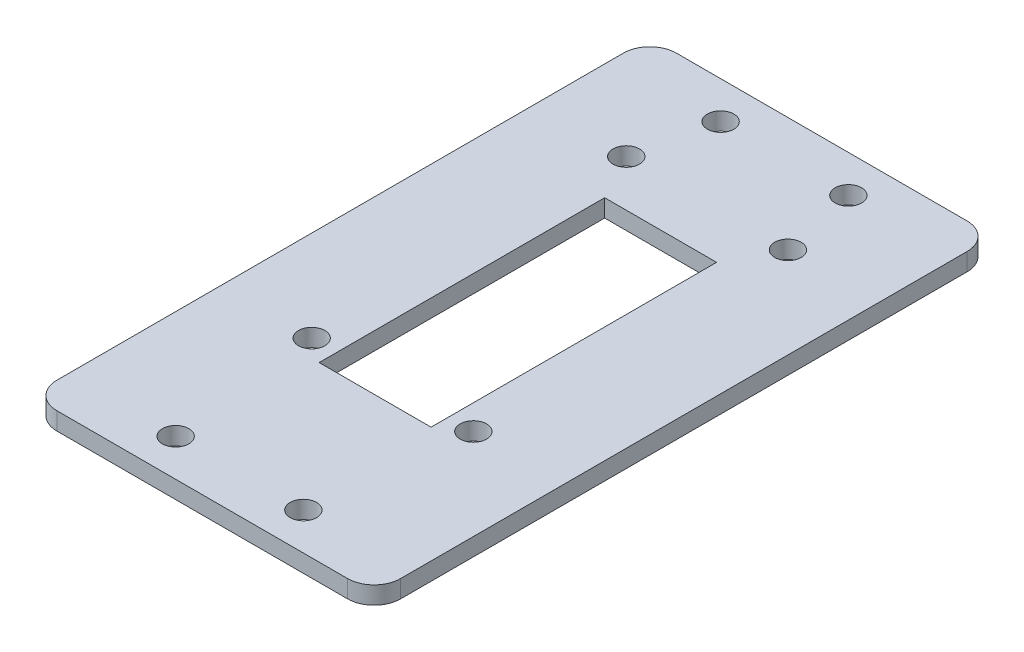
ISO-10303-21;
HEADER;
FILE_DESCRIPTION(('STEP AP214'),'2;1');
FILE_NAME('part.step','',(''),(''),'','','');
FILE_SCHEMA(('AUTOMOTIVE_DESIGN { 1 0 10303 214 1 1 1 1 }'));
ENDSEC;
DATA;
#1=APPLICATION_CONTEXT('core data for automotive mechanical design processes');
#2=APPLICATION_PROTOCOL_DEFINITION('international standard','automotive_design',2000,#1);
#3=PRODUCT_CONTEXT('',#1,'mechanical');
#4=PRODUCT('Part','Part','',(#3));
#5=PRODUCT_RELATED_PRODUCT_CATEGORY('part','',(#4));
#6=PRODUCT_DEFINITION_FORMATION('','',#4);
#7=PRODUCT_DEFINITION_CONTEXT('part definition',#1,'design');
#8=PRODUCT_DEFINITION('design','',#6,#7);
#9=PRODUCT_DEFINITION_SHAPE('','',#8);
#10=(LENGTH_UNIT() NAMED_UNIT(*) SI_UNIT(.MILLI.,.METRE.));
#11=(NAMED_UNIT(*) PLANE_ANGLE_UNIT() SI_UNIT($,.RADIAN.));
#12=(NAMED_UNIT(*) SI_UNIT($,.STERADIAN.) SOLID_ANGLE_UNIT());
#13=UNCERTAINTY_MEASURE_WITH_UNIT(LENGTH_MEASURE(1.E-05),#10,'distance_accuracy_value','');
#14=(GEOMETRIC_REPRESENTATION_CONTEXT(3) GLOBAL_UNCERTAINTY_ASSIGNED_CONTEXT((#13)) GLOBAL_UNIT_ASSIGNED_CONTEXT((#10,
#11,#12)) REPRESENTATION_CONTEXT('',''));
#15=CARTESIAN_POINT('',(0.,0.,0.));
#16=DIRECTION('',(0.,0.,1.));
#17=DIRECTION('',(1.,0.,0.));
#18=AXIS2_PLACEMENT_3D('',#15,#16,#17);
#19=CARTESIAN_POINT('',(-19.5,-2.,-39.6846189432334));
#20=DIRECTION('',(-1.,0.,0.));
#21=DIRECTION('',(0.,0.,1.));
#22=AXIS2_PLACEMENT_3D('',#19,#20,#21);
#23=PLANE('',#22);
#24=DIRECTION('',(0.,0.,1.));
#25=VECTOR('',#24,1.);
#26=CARTESIAN_POINT('',(-19.5,0.,-39.6846189432334));
#27=LINE('',#26,#25);
#28=CARTESIAN_POINT('',(-19.5,0.,-36.6846189432334));
#29=VERTEX_POINT('',#28);
#30=CARTESIAN_POINT('',(-19.5,0.,27.6153810567666));
#31=VERTEX_POINT('',#30);
#32=EDGE_CURVE('E245',#29,#31,#27,.T.);
#33=ORIENTED_EDGE('',*,*,#32,.F.);
#34=DIRECTION('',(0.,1.,0.));
#35=VECTOR('',#34,1.);
#36=CARTESIAN_POINT('',(-19.5,-2.,-36.6846189432334));
#37=LINE('',#36,#35);
#38=CARTESIAN_POINT('',(-19.5,-2.,-36.6846189432334));
#39=VERTEX_POINT('',#38);
#40=EDGE_CURVE('E302',#29,#39,#37,.F.);
#41=ORIENTED_EDGE('',*,*,#40,.T.);
#42=DIRECTION('',(0.,0.,1.));
#43=VECTOR('',#42,1.);
#44=CARTESIAN_POINT('',(-19.5,-2.,-39.6846189432334));
#45=LINE('',#44,#43);
#46=CARTESIAN_POINT('',(-19.5,-2.,27.6153810567666));
#47=VERTEX_POINT('',#46);
#48=EDGE_CURVE('E249',#39,#47,#45,.T.);
#49=ORIENTED_EDGE('',*,*,#48,.T.);
#50=DIRECTION('',(0.,1.,0.));
#51=VECTOR('',#50,1.);
#52=CARTESIAN_POINT('',(-19.5,-2.,27.6153810567666));
#53=LINE('',#52,#51);
#54=EDGE_CURVE('E298',#47,#31,#53,.T.);
#55=ORIENTED_EDGE('',*,*,#54,.T.);
#56=EDGE_LOOP('',(#33,#41,#49,#55));
#57=FACE_BOUND('',#56,.T.);
#58=ADVANCED_FACE('F39',(#57),#23,.T.);
#59=CARTESIAN_POINT('',(19.5,-2.,-39.6846189432334));
#60=DIRECTION('',(0.,0.,-1.));
#61=DIRECTION('',(-1.,0.,0.));
#62=AXIS2_PLACEMENT_3D('',#59,#60,#61);
#63=PLANE('',#62);
#64=DIRECTION('',(-1.,0.,0.));
#65=VECTOR('',#64,1.);
#66=CARTESIAN_POINT('',(19.5,-2.,-39.6846189432334));
#67=LINE('',#66,#65);
#68=CARTESIAN_POINT('',(16.5,-2.,-39.6846189432334));
#69=VERTEX_POINT('',#68);
#70=CARTESIAN_POINT('',(-16.5,-2.,-39.6846189432334));
#71=VERTEX_POINT('',#70);
#72=EDGE_CURVE('E261',#69,#71,#67,.T.);
#73=ORIENTED_EDGE('',*,*,#72,.T.);
#74=DIRECTION('',(0.,1.,0.));
#75=VECTOR('',#74,1.);
#76=CARTESIAN_POINT('',(-16.5,-2.,-39.6846189432334));
#77=LINE('',#76,#75);
#78=CARTESIAN_POINT('',(-16.5,0.,-39.6846189432334));
#79=VERTEX_POINT('',#78);
#80=EDGE_CURVE('E282',#71,#79,#77,.T.);
#81=ORIENTED_EDGE('',*,*,#80,.T.);
#82=DIRECTION('',(-1.,0.,0.));
#83=VECTOR('',#82,1.);
#84=CARTESIAN_POINT('',(19.5,0.,-39.6846189432334));
#85=LINE('',#84,#83);
#86=CARTESIAN_POINT('',(16.5,0.,-39.6846189432334));
#87=VERTEX_POINT('',#86);
#88=EDGE_CURVE('E254',#87,#79,#85,.T.);
#89=ORIENTED_EDGE('',*,*,#88,.F.);
#90=DIRECTION('',(0.,1.,0.));
#91=VECTOR('',#90,1.);
#92=CARTESIAN_POINT('',(16.5,-2.,-39.6846189432334));
#93=LINE('',#92,#91);
#94=EDGE_CURVE('E265',#87,#69,#93,.F.);
#95=ORIENTED_EDGE('',*,*,#94,.T.);
#96=EDGE_LOOP('',(#73,#81,#89,#95));
#97=FACE_BOUND('',#96,.T.);
#98=ADVANCED_FACE('F345',(#97),#63,.T.);
#99=CARTESIAN_POINT('',(19.5,-2.,30.6153810567666));
#100=DIRECTION('',(1.,0.,0.));
#101=DIRECTION('',(0.,0.,-1.));
#102=AXIS2_PLACEMENT_3D('',#99,#100,#101);
#103=PLANE('',#102);
#104=DIRECTION('',(0.,0.,-1.));
#105=VECTOR('',#104,1.);
#106=CARTESIAN_POINT('',(19.5,-2.,30.6153810567666));
#107=LINE('',#106,#105);
#108=CARTESIAN_POINT('',(19.5,-2.,27.6153810567666));
#109=VERTEX_POINT('',#108);
#110=CARTESIAN_POINT('',(19.5,-2.,-36.6846189432334));
#111=VERTEX_POINT('',#110);
#112=EDGE_CURVE('E257',#109,#111,#107,.T.);
#113=ORIENTED_EDGE('',*,*,#112,.T.);
#114=DIRECTION('',(0.,1.,0.));
#115=VECTOR('',#114,1.);
#116=CARTESIAN_POINT('',(19.5,-2.,-36.6846189432334));
#117=LINE('',#116,#115);
#118=CARTESIAN_POINT('',(19.5,0.,-36.6846189432334));
#119=VERTEX_POINT('',#118);
#120=EDGE_CURVE('E319',#111,#119,#117,.T.);
#121=ORIENTED_EDGE('',*,*,#120,.T.);
#122=DIRECTION('',(0.,0.,-1.));
#123=VECTOR('',#122,1.);
#124=CARTESIAN_POINT('',(19.5,0.,30.6153810567666));
#125=LINE('',#124,#123);
#126=CARTESIAN_POINT('',(19.5,0.,27.6153810567666));
#127=VERTEX_POINT('',#126);
#128=EDGE_CURVE('E273',#127,#119,#125,.T.);
#129=ORIENTED_EDGE('',*,*,#128,.F.);
#130=DIRECTION('',(0.,1.,0.));
#131=VECTOR('',#130,1.);
#132=CARTESIAN_POINT('',(19.5,-2.,27.6153810567666));
#133=LINE('',#132,#131);
#134=EDGE_CURVE('E316',#127,#109,#133,.F.);
#135=ORIENTED_EDGE('',*,*,#134,.T.);
#136=EDGE_LOOP('',(#113,#121,#129,#135));
#137=FACE_BOUND('',#136,.T.);
#138=ADVANCED_FACE('F352',(#137),#103,.T.);
#139=CARTESIAN_POINT('',(-19.5,-2.,30.6153810567666));
#140=DIRECTION('',(0.,0.,1.));
#141=DIRECTION('',(1.,0.,0.));
#142=AXIS2_PLACEMENT_3D('',#139,#140,#141);
#143=PLANE('',#142);
#144=DIRECTION('',(1.,0.,0.));
#145=VECTOR('',#144,1.);
#146=CARTESIAN_POINT('',(-19.5,0.,30.6153810567666));
#147=LINE('',#146,#145);
#148=CARTESIAN_POINT('',(-16.5,0.,30.6153810567666));
#149=VERTEX_POINT('',#148);
#150=CARTESIAN_POINT('',(16.5,0.,30.6153810567666));
#151=VERTEX_POINT('',#150);
#152=EDGE_CURVE('E269',#149,#151,#147,.T.);
#153=ORIENTED_EDGE('',*,*,#152,.F.);
#154=DIRECTION('',(0.,1.,0.));
#155=VECTOR('',#154,1.);
#156=CARTESIAN_POINT('',(-16.5,-2.,30.6153810567666));
#157=LINE('',#156,#155);
#158=CARTESIAN_POINT('',(-16.5,-2.,30.6153810567666));
#159=VERTEX_POINT('',#158);
#160=EDGE_CURVE('E11',#149,#159,#157,.F.);
#161=ORIENTED_EDGE('',*,*,#160,.T.);
#162=DIRECTION('',(1.,0.,0.));
#163=VECTOR('',#162,1.);
#164=CARTESIAN_POINT('',(-19.5,-2.,30.6153810567666));
#165=LINE('',#164,#163);
#166=CARTESIAN_POINT('',(16.5,-2.,30.6153810567666));
#167=VERTEX_POINT('',#166);
#168=EDGE_CURVE('E253',#159,#167,#165,.T.);
#169=ORIENTED_EDGE('',*,*,#168,.T.);
#170=DIRECTION('',(0.,1.,0.));
#171=VECTOR('',#170,1.);
#172=CARTESIAN_POINT('',(16.5,-2.,30.6153810567666));
#173=LINE('',#172,#171);
#174=EDGE_CURVE('E48',#167,#151,#173,.T.);
#175=ORIENTED_EDGE('',*,*,#174,.T.);
#176=EDGE_LOOP('',(#153,#161,#169,#175));
#177=FACE_BOUND('',#176,.T.);
#178=ADVANCED_FACE('F325',(#177),#143,.T.);
#179=CARTESIAN_POINT('',(0.,-2.,0.));
#180=DIRECTION('',(0.,1.,0.));
#181=DIRECTION('',(0.,0.,1.));
#182=AXIS2_PLACEMENT_3D('',#179,#180,#181);
#183=PLANE('',#182);
#184=DIRECTION('',(-1.,0.,0.));
#185=VECTOR('',#184,1.);
#186=CARTESIAN_POINT('',(-6.35,-2.,-21.4));
#187=LINE('',#186,#185);
#188=CARTESIAN_POINT('',(6.34999999999999,-2.,-21.4));
#189=VERTEX_POINT('',#188);
#190=CARTESIAN_POINT('',(-6.35,-2.,-21.4));
#191=VERTEX_POINT('',#190);
#192=EDGE_CURVE('E142',#189,#191,#187,.T.);
#193=ORIENTED_EDGE('',*,*,#192,.T.);
#194=DIRECTION('',(0.,0.,1.));
#195=VECTOR('',#194,1.);
#196=CARTESIAN_POINT('',(-6.35,-2.,-21.4));
#197=LINE('',#196,#195);
#198=CARTESIAN_POINT('',(-6.35,-2.,11.));
#199=VERTEX_POINT('',#198);
#200=EDGE_CURVE('E133',#191,#199,#197,.T.);
#201=ORIENTED_EDGE('',*,*,#200,.T.);
#202=DIRECTION('',(1.,0.,0.));
#203=VECTOR('',#202,1.);
#204=CARTESIAN_POINT('',(-6.35,-2.,11.));
#205=LINE('',#204,#203);
#206=CARTESIAN_POINT('',(6.35,-2.,11.));
#207=VERTEX_POINT('',#206);
#208=EDGE_CURVE('E146',#199,#207,#205,.T.);
#209=ORIENTED_EDGE('',*,*,#208,.T.);
#210=DIRECTION('',(0.,0.,-1.));
#211=VECTOR('',#210,1.);
#212=CARTESIAN_POINT('',(6.34999999999999,-2.,-21.4));
#213=LINE('',#212,#211);
#214=EDGE_CURVE('E151',#207,#189,#213,.T.);
#215=ORIENTED_EDGE('',*,*,#214,.T.);
#216=EDGE_LOOP('',(#193,#201,#209,#215));
#217=FACE_BOUND('',#216,.T.);
#218=CARTESIAN_POINT('',(-9.175,-2.,9.02500000000001));
#219=DIRECTION('',(0.,1.,0.));
#220=DIRECTION('',(0.,0.,1.));
#221=AXIS2_PLACEMENT_3D('',#218,#219,#220);
#222=CIRCLE('',#221,1.5);
#223=CARTESIAN_POINT('',(-9.175,-2.,10.525));
#224=VERTEX_POINT('',#223);
#225=EDGE_CURVE('E185',#224,#224,#222,.T.);
#226=ORIENTED_EDGE('',*,*,#225,.T.);
#227=EDGE_LOOP('',(#226));
#228=FACE_BOUND('',#227,.T.);
#229=CARTESIAN_POINT('',(-9.17499999999999,-2.,-26.675));
#230=DIRECTION('',(0.,1.,0.));
#231=DIRECTION('',(0.,0.,1.));
#232=AXIS2_PLACEMENT_3D('',#229,#230,#231);
#233=CIRCLE('',#232,1.5);
#234=CARTESIAN_POINT('',(-9.17499999999999,-2.,-25.175));
#235=VERTEX_POINT('',#234);
#236=EDGE_CURVE('E193',#235,#235,#233,.T.);
#237=ORIENTED_EDGE('',*,*,#236,.T.);
#238=EDGE_LOOP('',(#237));
#239=FACE_BOUND('',#238,.T.);
#240=CARTESIAN_POINT('',(9.175,-2.,9.02500000000001));
#241=DIRECTION('',(0.,1.,0.));
#242=DIRECTION('',(0.,0.,1.));
#243=AXIS2_PLACEMENT_3D('',#240,#241,#242);
#244=CIRCLE('',#243,1.5);
#245=CARTESIAN_POINT('',(9.175,-2.,10.525));
#246=VERTEX_POINT('',#245);
#247=EDGE_CURVE('E201',#246,#246,#244,.T.);
#248=ORIENTED_EDGE('',*,*,#247,.T.);
#249=EDGE_LOOP('',(#248));
#250=FACE_BOUND('',#249,.T.);
#251=CARTESIAN_POINT('',(9.175,-2.,-26.675));
#252=DIRECTION('',(0.,1.,0.));
#253=DIRECTION('',(0.,0.,1.));
#254=AXIS2_PLACEMENT_3D('',#251,#252,#253);
#255=CIRCLE('',#254,1.5);
#256=CARTESIAN_POINT('',(9.175,-2.,-25.175));
#257=VERTEX_POINT('',#256);
#258=EDGE_CURVE('E209',#257,#257,#255,.T.);
#259=ORIENTED_EDGE('',*,*,#258,.T.);
#260=EDGE_LOOP('',(#259));
#261=FACE_BOUND('',#260,.T.);
#262=CARTESIAN_POINT('',(-7.25000000000005,-2.,26.3903810567666));
#263=DIRECTION('',(0.,1.,0.));
#264=DIRECTION('',(0.,0.,1.));
#265=AXIS2_PLACEMENT_3D('',#262,#263,#264);
#266=CIRCLE('',#265,1.5);
#267=CARTESIAN_POINT('',(-7.25000000000005,-2.,27.8903810567666));
#268=VERTEX_POINT('',#267);
#269=EDGE_CURVE('E217',#268,#268,#266,.T.);
#270=ORIENTED_EDGE('',*,*,#269,.T.);
#271=EDGE_LOOP('',(#270));
#272=FACE_BOUND('',#271,.T.);
#273=CARTESIAN_POINT('',(7.24999999999995,-2.,26.3903810567666));
#274=DIRECTION('',(0.,1.,0.));
#275=DIRECTION('',(0.,0.,1.));
#276=AXIS2_PLACEMENT_3D('',#273,#274,#275);
#277=CIRCLE('',#276,1.5);
#278=CARTESIAN_POINT('',(7.24999999999995,-2.,27.8903810567666));
#279=VERTEX_POINT('',#278);
#280=EDGE_CURVE('E225',#279,#279,#277,.T.);
#281=ORIENTED_EDGE('',*,*,#280,.T.);
#282=EDGE_LOOP('',(#281));
#283=FACE_BOUND('',#282,.T.);
#284=CARTESIAN_POINT('',(7.24999999999995,-2.,-35.4596189432334));
#285=DIRECTION('',(0.,1.,0.));
#286=DIRECTION('',(0.,0.,1.));
#287=AXIS2_PLACEMENT_3D('',#284,#285,#286);
#288=CIRCLE('',#287,1.5);
#289=CARTESIAN_POINT('',(7.24999999999995,-2.,-33.9596189432334));
#290=VERTEX_POINT('',#289);
#291=EDGE_CURVE('E233',#290,#290,#288,.T.);
#292=ORIENTED_EDGE('',*,*,#291,.T.);
#293=EDGE_LOOP('',(#292));
#294=FACE_BOUND('',#293,.T.);
#295=CARTESIAN_POINT('',(-7.25000000000005,-2.,-35.4596189432334));
#296=DIRECTION('',(0.,1.,0.));
#297=DIRECTION('',(0.,0.,1.));
#298=AXIS2_PLACEMENT_3D('',#295,#296,#297);
#299=CIRCLE('',#298,1.5);
#300=CARTESIAN_POINT('',(-7.25000000000005,-2.,-33.9596189432334));
#301=VERTEX_POINT('',#300);
#302=EDGE_CURVE('E241',#301,#301,#299,.T.);
#303=ORIENTED_EDGE('',*,*,#302,.T.);
#304=EDGE_LOOP('',(#303));
#305=FACE_BOUND('',#304,.T.);
#306=ORIENTED_EDGE('',*,*,#48,.F.);
#307=CARTESIAN_POINT('',(-16.5,-2.,-36.6846189432334));
#308=DIRECTION('',(0.,1.,0.));
#309=DIRECTION('',(0.,0.,1.));
#310=AXIS2_PLACEMENT_3D('',#307,#308,#309);
#311=CIRCLE('',#310,3.);
#312=EDGE_CURVE('E313',#39,#71,#311,.F.);
#313=ORIENTED_EDGE('',*,*,#312,.T.);
#314=ORIENTED_EDGE('',*,*,#72,.F.);
#315=CARTESIAN_POINT('',(16.5,-2.,-36.6846189432334));
#316=DIRECTION('',(0.,1.,0.));
#317=DIRECTION('',(0.,0.,1.));
#318=AXIS2_PLACEMENT_3D('',#315,#316,#317);
#319=CIRCLE('',#318,3.);
#320=EDGE_CURVE('E310',#69,#111,#319,.F.);
#321=ORIENTED_EDGE('',*,*,#320,.T.);
#322=ORIENTED_EDGE('',*,*,#112,.F.);
#323=CARTESIAN_POINT('',(16.5,-2.,27.6153810567666));
#324=DIRECTION('',(0.,1.,0.));
#325=DIRECTION('',(0.,0.,1.));
#326=AXIS2_PLACEMENT_3D('',#323,#324,#325);
#327=CIRCLE('',#326,3.);
#328=EDGE_CURVE('E55',#109,#167,#327,.F.);
#329=ORIENTED_EDGE('',*,*,#328,.T.);
#330=ORIENTED_EDGE('',*,*,#168,.F.);
#331=CARTESIAN_POINT('',(-16.5,-2.,27.6153810567666));
#332=DIRECTION('',(0.,1.,0.));
#333=DIRECTION('',(0.,0.,1.));
#334=AXIS2_PLACEMENT_3D('',#331,#332,#333);
#335=CIRCLE('',#334,3.);
#336=EDGE_CURVE('E307',#159,#47,#335,.F.);
#337=ORIENTED_EDGE('',*,*,#336,.T.);
#338=EDGE_LOOP('',(#306,#313,#314,#321,#322,#329,#330,#337));
#339=FACE_BOUND('',#338,.T.);
#340=ADVANCED_FACE('F153',(#217,#228,#239,#250,#261,#272,#283,#294,#305,#339),#183,.F.);
#341=CARTESIAN_POINT('',(0.,0.,0.));
#342=DIRECTION('',(0.,1.,0.));
#343=DIRECTION('',(0.,0.,1.));
#344=AXIS2_PLACEMENT_3D('',#341,#342,#343);
#345=PLANE('',#344);
#346=DIRECTION('',(0.,0.,1.));
#347=VECTOR('',#346,1.);
#348=CARTESIAN_POINT('',(-6.35,0.,-21.4));
#349=LINE('',#348,#347);
#350=CARTESIAN_POINT('',(-6.35,0.,-21.4));
#351=VERTEX_POINT('',#350);
#352=CARTESIAN_POINT('',(-6.35,0.,11.));
#353=VERTEX_POINT('',#352);
#354=EDGE_CURVE('E136',#351,#353,#349,.T.);
#355=ORIENTED_EDGE('',*,*,#354,.F.);
#356=DIRECTION('',(-1.,0.,0.));
#357=VECTOR('',#356,1.);
#358=CARTESIAN_POINT('',(-6.35,0.,-21.4));
#359=LINE('',#358,#357);
#360=CARTESIAN_POINT('',(6.34999999999999,0.,-21.4));
#361=VERTEX_POINT('',#360);
#362=EDGE_CURVE('E157',#361,#351,#359,.T.);
#363=ORIENTED_EDGE('',*,*,#362,.F.);
#364=DIRECTION('',(0.,0.,-1.));
#365=VECTOR('',#364,1.);
#366=CARTESIAN_POINT('',(6.34999999999999,0.,-21.4));
#367=LINE('',#366,#365);
#368=CARTESIAN_POINT('',(6.35,0.,11.));
#369=VERTEX_POINT('',#368);
#370=EDGE_CURVE('E161',#369,#361,#367,.T.);
#371=ORIENTED_EDGE('',*,*,#370,.F.);
#372=DIRECTION('',(1.,0.,0.));
#373=VECTOR('',#372,1.);
#374=CARTESIAN_POINT('',(-6.35,0.,11.));
#375=LINE('',#374,#373);
#376=EDGE_CURVE('E170',#353,#369,#375,.T.);
#377=ORIENTED_EDGE('',*,*,#376,.F.);
#378=EDGE_LOOP('',(#355,#363,#371,#377));
#379=FACE_BOUND('',#378,.T.);
#380=CARTESIAN_POINT('',(-9.175,0.,9.02500000000001));
#381=DIRECTION('',(0.,1.,0.));
#382=DIRECTION('',(0.,0.,1.));
#383=AXIS2_PLACEMENT_3D('',#380,#381,#382);
#384=CIRCLE('',#383,1.5);
#385=CARTESIAN_POINT('',(-9.175,0.,10.525));
#386=VERTEX_POINT('',#385);
#387=EDGE_CURVE('E179',#386,#386,#384,.T.);
#388=ORIENTED_EDGE('',*,*,#387,.F.);
#389=EDGE_LOOP('',(#388));
#390=FACE_BOUND('',#389,.T.);
#391=CARTESIAN_POINT('',(-9.17499999999999,0.,-26.675));
#392=DIRECTION('',(0.,1.,0.));
#393=DIRECTION('',(0.,0.,1.));
#394=AXIS2_PLACEMENT_3D('',#391,#392,#393);
#395=CIRCLE('',#394,1.5);
#396=CARTESIAN_POINT('',(-9.17499999999999,0.,-25.175));
#397=VERTEX_POINT('',#396);
#398=EDGE_CURVE('E189',#397,#397,#395,.T.);
#399=ORIENTED_EDGE('',*,*,#398,.F.);
#400=EDGE_LOOP('',(#399));
#401=FACE_BOUND('',#400,.T.);
#402=CARTESIAN_POINT('',(9.175,0.,9.02500000000001));
#403=DIRECTION('',(0.,1.,0.));
#404=DIRECTION('',(0.,0.,1.));
#405=AXIS2_PLACEMENT_3D('',#402,#403,#404);
#406=CIRCLE('',#405,1.5);
#407=CARTESIAN_POINT('',(9.175,0.,10.525));
#408=VERTEX_POINT('',#407);
#409=EDGE_CURVE('E197',#408,#408,#406,.T.);
#410=ORIENTED_EDGE('',*,*,#409,.F.);
#411=EDGE_LOOP('',(#410));
#412=FACE_BOUND('',#411,.T.);
#413=CARTESIAN_POINT('',(9.175,0.,-26.675));
#414=DIRECTION('',(0.,1.,0.));
#415=DIRECTION('',(0.,0.,1.));
#416=AXIS2_PLACEMENT_3D('',#413,#414,#415);
#417=CIRCLE('',#416,1.5);
#418=CARTESIAN_POINT('',(9.175,0.,-25.175));
#419=VERTEX_POINT('',#418);
#420=EDGE_CURVE('E205',#419,#419,#417,.T.);
#421=ORIENTED_EDGE('',*,*,#420,.F.);
#422=EDGE_LOOP('',(#421));
#423=FACE_BOUND('',#422,.T.);
#424=CARTESIAN_POINT('',(-7.25000000000005,0.,26.3903810567666));
#425=DIRECTION('',(0.,1.,0.));
#426=DIRECTION('',(0.,0.,1.));
#427=AXIS2_PLACEMENT_3D('',#424,#425,#426);
#428=CIRCLE('',#427,1.5);
#429=CARTESIAN_POINT('',(-7.25000000000005,0.,27.8903810567666));
#430=VERTEX_POINT('',#429);
#431=EDGE_CURVE('E213',#430,#430,#428,.T.);
#432=ORIENTED_EDGE('',*,*,#431,.F.);
#433=EDGE_LOOP('',(#432));
#434=FACE_BOUND('',#433,.T.);
#435=CARTESIAN_POINT('',(7.24999999999995,0.,26.3903810567666));
#436=DIRECTION('',(0.,1.,0.));
#437=DIRECTION('',(0.,0.,1.));
#438=AXIS2_PLACEMENT_3D('',#435,#436,#437);
#439=CIRCLE('',#438,1.5);
#440=CARTESIAN_POINT('',(7.24999999999995,0.,27.8903810567666));
#441=VERTEX_POINT('',#440);
#442=EDGE_CURVE('E221',#441,#441,#439,.T.);
#443=ORIENTED_EDGE('',*,*,#442,.F.);
#444=EDGE_LOOP('',(#443));
#445=FACE_BOUND('',#444,.T.);
#446=CARTESIAN_POINT('',(7.24999999999995,0.,-35.4596189432334));
#447=DIRECTION('',(0.,1.,0.));
#448=DIRECTION('',(0.,0.,1.));
#449=AXIS2_PLACEMENT_3D('',#446,#447,#448);
#450=CIRCLE('',#449,1.5);
#451=CARTESIAN_POINT('',(7.24999999999995,0.,-33.9596189432334));
#452=VERTEX_POINT('',#451);
#453=EDGE_CURVE('E229',#452,#452,#450,.T.);
#454=ORIENTED_EDGE('',*,*,#453,.F.);
#455=EDGE_LOOP('',(#454));
#456=FACE_BOUND('',#455,.T.);
#457=CARTESIAN_POINT('',(-7.25000000000005,0.,-35.4596189432334));
#458=DIRECTION('',(0.,1.,0.));
#459=DIRECTION('',(0.,0.,1.));
#460=AXIS2_PLACEMENT_3D('',#457,#458,#459);
#461=CIRCLE('',#460,1.5);
#462=CARTESIAN_POINT('',(-7.25000000000005,0.,-33.9596189432334));
#463=VERTEX_POINT('',#462);
#464=EDGE_CURVE('E237',#463,#463,#461,.T.);
#465=ORIENTED_EDGE('',*,*,#464,.F.);
#466=EDGE_LOOP('',(#465));
#467=FACE_BOUND('',#466,.T.);
#468=ORIENTED_EDGE('',*,*,#88,.T.);
#469=CARTESIAN_POINT('',(-16.5,0.,-36.6846189432334));
#470=DIRECTION('',(0.,1.,0.));
#471=DIRECTION('',(0.,0.,1.));
#472=AXIS2_PLACEMENT_3D('',#469,#470,#471);
#473=CIRCLE('',#472,3.);
#474=EDGE_CURVE('E295',#79,#29,#473,.T.);
#475=ORIENTED_EDGE('',*,*,#474,.T.);
#476=ORIENTED_EDGE('',*,*,#32,.T.);
#477=CARTESIAN_POINT('',(-16.5,0.,27.6153810567666));
#478=DIRECTION('',(0.,1.,0.));
#479=DIRECTION('',(0.,0.,1.));
#480=AXIS2_PLACEMENT_3D('',#477,#478,#479);
#481=CIRCLE('',#480,3.);
#482=EDGE_CURVE('E289',#31,#149,#481,.T.);
#483=ORIENTED_EDGE('',*,*,#482,.T.);
#484=ORIENTED_EDGE('',*,*,#152,.T.);
#485=CARTESIAN_POINT('',(16.5,0.,27.6153810567666));
#486=DIRECTION('',(0.,1.,0.));
#487=DIRECTION('',(0.,0.,1.));
#488=AXIS2_PLACEMENT_3D('',#485,#486,#487);
#489=CIRCLE('',#488,3.);
#490=EDGE_CURVE('E286',#151,#127,#489,.T.);
#491=ORIENTED_EDGE('',*,*,#490,.T.);
#492=ORIENTED_EDGE('',*,*,#128,.T.);
#493=CARTESIAN_POINT('',(16.5,0.,-36.6846189432334));
#494=DIRECTION('',(0.,1.,0.));
#495=DIRECTION('',(0.,0.,1.));
#496=AXIS2_PLACEMENT_3D('',#493,#494,#495);
#497=CIRCLE('',#496,3.);
#498=EDGE_CURVE('E292',#119,#87,#497,.T.);
#499=ORIENTED_EDGE('',*,*,#498,.T.);
#500=EDGE_LOOP('',(#468,#475,#476,#483,#484,#491,#492,#499));
#501=FACE_BOUND('',#500,.T.);
#502=ADVANCED_FACE('F328',(#379,#390,#401,#412,#423,#434,#445,#456,#467,#501),#345,.T.);
#503=CARTESIAN_POINT('',(-7.25000000000005,-2.,-35.4596189432334));
#504=DIRECTION('',(0.,1.,0.));
#505=DIRECTION('',(0.,0.,1.));
#506=AXIS2_PLACEMENT_3D('',#503,#504,#505);
#507=CYLINDRICAL_SURFACE('',#506,1.5);
#508=ORIENTED_EDGE('',*,*,#302,.F.);
#509=EDGE_LOOP('',(#508));
#510=FACE_BOUND('',#509,.T.);
#511=ORIENTED_EDGE('',*,*,#464,.T.);
#512=EDGE_LOOP('',(#511));
#513=FACE_BOUND('',#512,.T.);
#514=ADVANCED_FACE('F486',(#510,#513),#507,.F.);
#515=CARTESIAN_POINT('',(7.24999999999995,-2.,-35.4596189432334));
#516=DIRECTION('',(0.,1.,0.));
#517=DIRECTION('',(0.,0.,1.));
#518=AXIS2_PLACEMENT_3D('',#515,#516,#517);
#519=CYLINDRICAL_SURFACE('',#518,1.5);
#520=ORIENTED_EDGE('',*,*,#291,.F.);
#521=EDGE_LOOP('',(#520));
#522=FACE_BOUND('',#521,.T.);
#523=ORIENTED_EDGE('',*,*,#453,.T.);
#524=EDGE_LOOP('',(#523));
#525=FACE_BOUND('',#524,.T.);
#526=ADVANCED_FACE('F477',(#522,#525),#519,.F.);
#527=CARTESIAN_POINT('',(7.24999999999995,-2.,26.3903810567666));
#528=DIRECTION('',(0.,1.,0.));
#529=DIRECTION('',(0.,0.,1.));
#530=AXIS2_PLACEMENT_3D('',#527,#528,#529);
#531=CYLINDRICAL_SURFACE('',#530,1.5);
#532=ORIENTED_EDGE('',*,*,#280,.F.);
#533=EDGE_LOOP('',(#532));
#534=FACE_BOUND('',#533,.T.);
#535=ORIENTED_EDGE('',*,*,#442,.T.);
#536=EDGE_LOOP('',(#535));
#537=FACE_BOUND('',#536,.T.);
#538=ADVANCED_FACE('F468',(#534,#537),#531,.F.);
#539=CARTESIAN_POINT('',(-7.25000000000005,-2.,26.3903810567666));
#540=DIRECTION('',(0.,1.,0.));
#541=DIRECTION('',(0.,0.,1.));
#542=AXIS2_PLACEMENT_3D('',#539,#540,#541);
#543=CYLINDRICAL_SURFACE('',#542,1.5);
#544=ORIENTED_EDGE('',*,*,#269,.F.);
#545=EDGE_LOOP('',(#544));
#546=FACE_BOUND('',#545,.T.);
#547=ORIENTED_EDGE('',*,*,#431,.T.);
#548=EDGE_LOOP('',(#547));
#549=FACE_BOUND('',#548,.T.);
#550=ADVANCED_FACE('F459',(#546,#549),#543,.F.);
#551=CARTESIAN_POINT('',(9.175,-2.,-26.675));
#552=DIRECTION('',(0.,1.,0.));
#553=DIRECTION('',(0.,0.,1.));
#554=AXIS2_PLACEMENT_3D('',#551,#552,#553);
#555=CYLINDRICAL_SURFACE('',#554,1.5);
#556=ORIENTED_EDGE('',*,*,#258,.F.);
#557=EDGE_LOOP('',(#556));
#558=FACE_BOUND('',#557,.T.);
#559=ORIENTED_EDGE('',*,*,#420,.T.);
#560=EDGE_LOOP('',(#559));
#561=FACE_BOUND('',#560,.T.);
#562=ADVANCED_FACE('F450',(#558,#561),#555,.F.);
#563=CARTESIAN_POINT('',(9.175,-2.,9.02500000000001));
#564=DIRECTION('',(0.,1.,0.));
#565=DIRECTION('',(0.,0.,1.));
#566=AXIS2_PLACEMENT_3D('',#563,#564,#565);
#567=CYLINDRICAL_SURFACE('',#566,1.5);
#568=ORIENTED_EDGE('',*,*,#247,.F.);
#569=EDGE_LOOP('',(#568));
#570=FACE_BOUND('',#569,.T.);
#571=ORIENTED_EDGE('',*,*,#409,.T.);
#572=EDGE_LOOP('',(#571));
#573=FACE_BOUND('',#572,.T.);
#574=ADVANCED_FACE('F441',(#570,#573),#567,.F.);
#575=CARTESIAN_POINT('',(-9.17499999999999,-2.,-26.675));
#576=DIRECTION('',(0.,1.,0.));
#577=DIRECTION('',(0.,0.,1.));
#578=AXIS2_PLACEMENT_3D('',#575,#576,#577);
#579=CYLINDRICAL_SURFACE('',#578,1.5);
#580=ORIENTED_EDGE('',*,*,#236,.F.);
#581=EDGE_LOOP('',(#580));
#582=FACE_BOUND('',#581,.T.);
#583=ORIENTED_EDGE('',*,*,#398,.T.);
#584=EDGE_LOOP('',(#583));
#585=FACE_BOUND('',#584,.T.);
#586=ADVANCED_FACE('F432',(#582,#585),#579,.F.);
#587=CARTESIAN_POINT('',(-9.175,-2.,9.02500000000001));
#588=DIRECTION('',(0.,1.,0.));
#589=DIRECTION('',(0.,0.,1.));
#590=AXIS2_PLACEMENT_3D('',#587,#588,#589);
#591=CYLINDRICAL_SURFACE('',#590,1.5);
#592=ORIENTED_EDGE('',*,*,#225,.F.);
#593=EDGE_LOOP('',(#592));
#594=FACE_BOUND('',#593,.T.);
#595=ORIENTED_EDGE('',*,*,#387,.T.);
#596=EDGE_LOOP('',(#595));
#597=FACE_BOUND('',#596,.T.);
#598=ADVANCED_FACE('F424',(#594,#597),#591,.F.);
#599=CARTESIAN_POINT('',(-6.35,-2.,-21.4));
#600=DIRECTION('',(-1.,0.,0.));
#601=DIRECTION('',(0.,0.,1.));
#602=AXIS2_PLACEMENT_3D('',#599,#600,#601);
#603=PLANE('',#602);
#604=ORIENTED_EDGE('',*,*,#354,.T.);
#605=DIRECTION('',(0.,1.,0.));
#606=VECTOR('',#605,1.);
#607=CARTESIAN_POINT('',(-6.35,-2.,11.));
#608=LINE('',#607,#606);
#609=EDGE_CURVE('E129',#199,#353,#608,.T.);
#610=ORIENTED_EDGE('',*,*,#609,.F.);
#611=ORIENTED_EDGE('',*,*,#200,.F.);
#612=DIRECTION('',(0.,1.,0.));
#613=VECTOR('',#612,1.);
#614=CARTESIAN_POINT('',(-6.35,-2.,-21.4));
#615=LINE('',#614,#613);
#616=EDGE_CURVE('E176',#191,#351,#615,.T.);
#617=ORIENTED_EDGE('',*,*,#616,.T.);
#618=EDGE_LOOP('',(#604,#610,#611,#617));
#619=FACE_BOUND('',#618,.T.);
#620=ADVANCED_FACE('F131',(#619),#603,.F.);
#621=CARTESIAN_POINT('',(-6.35,-2.,-21.4));
#622=DIRECTION('',(0.,0.,-1.));
#623=DIRECTION('',(-1.,0.,0.));
#624=AXIS2_PLACEMENT_3D('',#621,#622,#623);
#625=PLANE('',#624);
#626=ORIENTED_EDGE('',*,*,#362,.T.);
#627=ORIENTED_EDGE('',*,*,#616,.F.);
#628=ORIENTED_EDGE('',*,*,#192,.F.);
#629=DIRECTION('',(0.,1.,0.));
#630=VECTOR('',#629,1.);
#631=CARTESIAN_POINT('',(6.34999999999999,-2.,-21.4));
#632=LINE('',#631,#630);
#633=EDGE_CURVE('E180',#189,#361,#632,.T.);
#634=ORIENTED_EDGE('',*,*,#633,.T.);
#635=EDGE_LOOP('',(#626,#627,#628,#634));
#636=FACE_BOUND('',#635,.T.);
#637=ADVANCED_FACE('F407',(#636),#625,.F.);
#638=CARTESIAN_POINT('',(6.34999999999999,-2.,-21.4));
#639=DIRECTION('',(1.,0.,0.));
#640=DIRECTION('',(0.,0.,-1.));
#641=AXIS2_PLACEMENT_3D('',#638,#639,#640);
#642=PLANE('',#641);
#643=ORIENTED_EDGE('',*,*,#370,.T.);
#644=ORIENTED_EDGE('',*,*,#633,.F.);
#645=ORIENTED_EDGE('',*,*,#214,.F.);
#646=DIRECTION('',(0.,1.,0.));
#647=VECTOR('',#646,1.);
#648=CARTESIAN_POINT('',(6.35,-2.,11.));
#649=LINE('',#648,#647);
#650=EDGE_CURVE('E141',#207,#369,#649,.T.);
#651=ORIENTED_EDGE('',*,*,#650,.T.);
#652=EDGE_LOOP('',(#643,#644,#645,#651));
#653=FACE_BOUND('',#652,.T.);
#654=ADVANCED_FACE('F399',(#653),#642,.F.);
#655=CARTESIAN_POINT('',(-6.35,-2.,11.));
#656=DIRECTION('',(0.,0.,1.));
#657=DIRECTION('',(1.,0.,0.));
#658=AXIS2_PLACEMENT_3D('',#655,#656,#657);
#659=PLANE('',#658);
#660=ORIENTED_EDGE('',*,*,#376,.T.);
#661=ORIENTED_EDGE('',*,*,#650,.F.);
#662=ORIENTED_EDGE('',*,*,#208,.F.);
#663=ORIENTED_EDGE('',*,*,#609,.T.);
#664=EDGE_LOOP('',(#660,#661,#662,#663));
#665=FACE_BOUND('',#664,.T.);
#666=ADVANCED_FACE('F147',(#665),#659,.F.);
#667=CARTESIAN_POINT('',(-16.5,-2.,-36.6846189432334));
#668=DIRECTION('',(0.,1.,0.));
#669=DIRECTION('',(0.,0.,1.));
#670=AXIS2_PLACEMENT_3D('',#667,#668,#669);
#671=CYLINDRICAL_SURFACE('',#670,3.);
#672=ORIENTED_EDGE('',*,*,#312,.F.);
#673=ORIENTED_EDGE('',*,*,#40,.F.);
#674=ORIENTED_EDGE('',*,*,#474,.F.);
#675=ORIENTED_EDGE('',*,*,#80,.F.);
#676=EDGE_LOOP('',(#672,#673,#674,#675));
#677=FACE_BOUND('',#676,.T.);
#678=ADVANCED_FACE('F342',(#677),#671,.T.);
#679=CARTESIAN_POINT('',(16.5,-2.,-36.6846189432334));
#680=DIRECTION('',(0.,1.,0.));
#681=DIRECTION('',(0.,0.,1.));
#682=AXIS2_PLACEMENT_3D('',#679,#680,#681);
#683=CYLINDRICAL_SURFACE('',#682,3.);
#684=ORIENTED_EDGE('',*,*,#320,.F.);
#685=ORIENTED_EDGE('',*,*,#94,.F.);
#686=ORIENTED_EDGE('',*,*,#498,.F.);
#687=ORIENTED_EDGE('',*,*,#120,.F.);
#688=EDGE_LOOP('',(#684,#685,#686,#687));
#689=FACE_BOUND('',#688,.T.);
#690=ADVANCED_FACE('F350',(#689),#683,.T.);
#691=CARTESIAN_POINT('',(-16.5,-2.,27.6153810567666));
#692=DIRECTION('',(0.,1.,0.));
#693=DIRECTION('',(0.,0.,1.));
#694=AXIS2_PLACEMENT_3D('',#691,#692,#693);
#695=CYLINDRICAL_SURFACE('',#694,3.);
#696=ORIENTED_EDGE('',*,*,#336,.F.);
#697=ORIENTED_EDGE('',*,*,#160,.F.);
#698=ORIENTED_EDGE('',*,*,#482,.F.);
#699=ORIENTED_EDGE('',*,*,#54,.F.);
#700=EDGE_LOOP('',(#696,#697,#698,#699));
#701=FACE_BOUND('',#700,.T.);
#702=ADVANCED_FACE('F334',(#701),#695,.T.);
#703=CARTESIAN_POINT('',(16.5,-2.,27.6153810567666));
#704=DIRECTION('',(0.,1.,0.));
#705=DIRECTION('',(0.,0.,1.));
#706=AXIS2_PLACEMENT_3D('',#703,#704,#705);
#707=CYLINDRICAL_SURFACE('',#706,3.);
#708=ORIENTED_EDGE('',*,*,#328,.F.);
#709=ORIENTED_EDGE('',*,*,#134,.F.);
#710=ORIENTED_EDGE('',*,*,#490,.F.);
#711=ORIENTED_EDGE('',*,*,#174,.F.);
#712=EDGE_LOOP('',(#708,#709,#710,#711));
#713=FACE_BOUND('',#712,.T.);
#714=ADVANCED_FACE('F41',(#713),#707,.T.);
#715=CLOSED_SHELL('',(#58,#98,#138,#178,#340,#502,#514,#526,#538,#550,#562,#574,#586,#598,#620,
#637,#654,#666,#678,#690,#702,#714));
#716=MANIFOLD_SOLID_BREP('B2',#715);
#717=ADVANCED_BREP_SHAPE_REPRESENTATION('',(#18,#716),#14);
#718=SHAPE_DEFINITION_REPRESENTATION(#9,#717);
ENDSEC;
END-ISO-10303-21;
